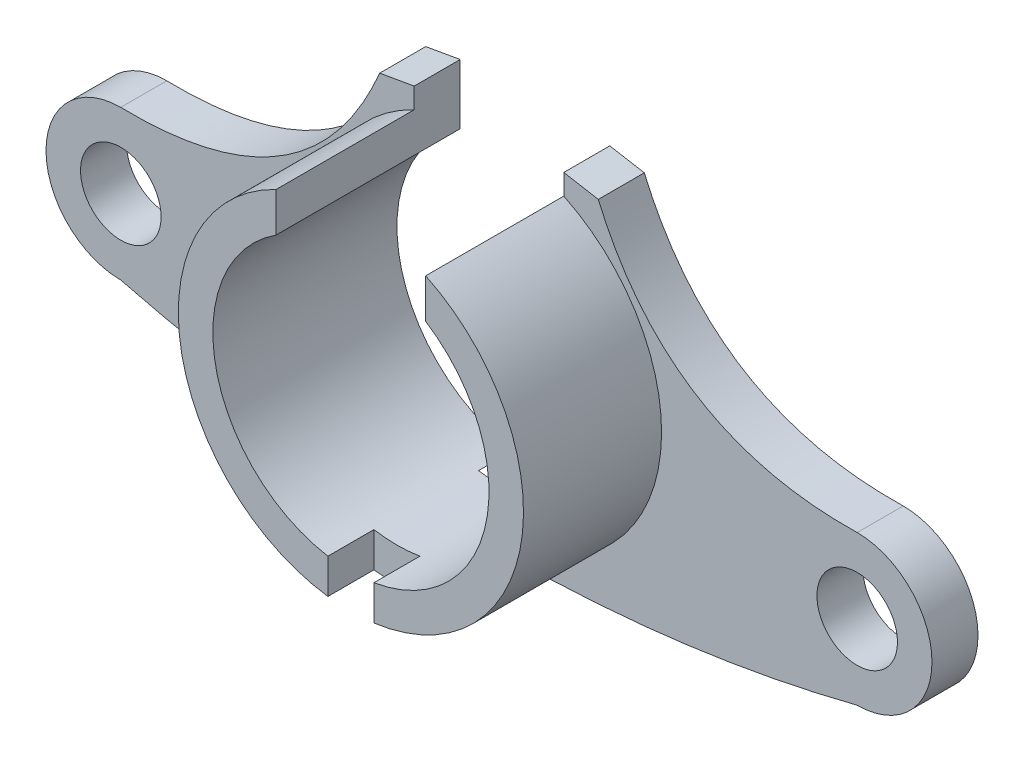
ISO-10303-21;
HEADER;
FILE_DESCRIPTION(('STEP AP214'),'2;1');
FILE_NAME('part.step','',(''),(''),'','','');
FILE_SCHEMA(('AUTOMOTIVE_DESIGN { 1 0 10303 214 1 1 1 1 }'));
ENDSEC;
DATA;
#1=APPLICATION_CONTEXT('core data for automotive mechanical design processes');
#2=APPLICATION_PROTOCOL_DEFINITION('international standard','automotive_design',2000,#1);
#3=PRODUCT_CONTEXT('',#1,'mechanical');
#4=PRODUCT('Part','Part','',(#3));
#5=PRODUCT_RELATED_PRODUCT_CATEGORY('part','',(#4));
#6=PRODUCT_DEFINITION_FORMATION('','',#4);
#7=PRODUCT_DEFINITION_CONTEXT('part definition',#1,'design');
#8=PRODUCT_DEFINITION('design','',#6,#7);
#9=PRODUCT_DEFINITION_SHAPE('','',#8);
#10=(LENGTH_UNIT() NAMED_UNIT(*) SI_UNIT(.MILLI.,.METRE.));
#11=(NAMED_UNIT(*) PLANE_ANGLE_UNIT() SI_UNIT($,.RADIAN.));
#12=(NAMED_UNIT(*) SI_UNIT($,.STERADIAN.) SOLID_ANGLE_UNIT());
#13=UNCERTAINTY_MEASURE_WITH_UNIT(LENGTH_MEASURE(1.E-05),#10,'distance_accuracy_value','');
#14=(GEOMETRIC_REPRESENTATION_CONTEXT(3) GLOBAL_UNCERTAINTY_ASSIGNED_CONTEXT((#13)) GLOBAL_UNIT_ASSIGNED_CONTEXT((#10,
#11,#12)) REPRESENTATION_CONTEXT('',''));
#15=CARTESIAN_POINT('',(0.,0.,0.));
#16=DIRECTION('',(0.,0.,1.));
#17=DIRECTION('',(1.,0.,0.));
#18=AXIS2_PLACEMENT_3D('',#15,#16,#17);
#19=CARTESIAN_POINT('',(0.,0.,0.));
#20=DIRECTION('',(0.,0.,1.));
#21=DIRECTION('',(1.,0.,0.));
#22=AXIS2_PLACEMENT_3D('',#19,#20,#21);
#23=PLANE('',#22);
#24=CARTESIAN_POINT('',(15.9999999999999,81.,0.));
#25=DIRECTION('',(0.,0.,1.));
#26=DIRECTION('',(1.,0.,0.));
#27=AXIS2_PLACEMENT_3D('',#24,#25,#26);
#28=CIRCLE('',#27,1.75);
#29=CARTESIAN_POINT('',(17.7499999999999,81.,0.));
#30=VERTEX_POINT('',#29);
#31=EDGE_CURVE('E312',#30,#30,#28,.T.);
#32=ORIENTED_EDGE('',*,*,#31,.T.);
#33=EDGE_LOOP('',(#32));
#34=FACE_BOUND('',#33,.T.);
#35=CARTESIAN_POINT('',(16.0000000000001,77.75,0.));
#36=CARTESIAN_POINT('',(8.1247968891264,75.7473200210934,0.));
#37=CARTESIAN_POINT('',(0.,75.7769373126975,0.));
#38=B_SPLINE_CURVE_WITH_KNOTS('',2,(#35,#36,#37),.UNSPECIFIED.,.F.,.F.,(3,3),(0.,1.),.UNSPECIFIED.);
#39=CARTESIAN_POINT('',(16.0000000000001,77.75,0.));
#40=VERTEX_POINT('',#39);
#41=CARTESIAN_POINT('',(2.69465862007577,75.8232627262224,0.));
#42=VERTEX_POINT('',#41);
#43=EDGE_CURVE('E287',#40,#42,#38,.T.);
#44=ORIENTED_EDGE('',*,*,#43,.T.);
#45=CARTESIAN_POINT('',(0.,75.2743411277665,0.));
#46=DIRECTION('',(0.,0.,1.));
#47=DIRECTION('',(1.,0.,0.));
#48=AXIS2_PLACEMENT_3D('',#45,#46,#47);
#49=CIRCLE('',#48,2.75);
#50=CARTESIAN_POINT('',(0.954559028470362,77.853355873976,0.));
#51=VERTEX_POINT('',#50);
#52=EDGE_CURVE('E42',#42,#51,#49,.T.);
#53=ORIENTED_EDGE('',*,*,#52,.T.);
#54=CARTESIAN_POINT('',(0.,83.7769373126975,0.));
#55=DIRECTION('',(0.,0.,1.));
#56=DIRECTION('',(1.,0.,0.));
#57=AXIS2_PLACEMENT_3D('',#54,#55,#56);
#58=CIRCLE('',#57,6.00000000000001);
#59=CARTESIAN_POINT('',(3.25,88.8204975631555,0.));
#60=VERTEX_POINT('',#59);
#61=EDGE_CURVE('E283',#51,#60,#58,.T.);
#62=ORIENTED_EDGE('',*,*,#61,.T.);
#63=DIRECTION('',(0.,1.,0.));
#64=VECTOR('',#63,1.);
#65=CARTESIAN_POINT('',(3.24999999999998,0.,0.));
#66=LINE('',#65,#64);
#67=CARTESIAN_POINT('',(3.25,91.4269373126975,0.));
#68=VERTEX_POINT('',#67);
#69=EDGE_CURVE('E297',#60,#68,#66,.T.);
#70=ORIENTED_EDGE('',*,*,#69,.T.);
#71=DIRECTION('',(-0.984807753012208,0.173648177666933,0.));
#72=VECTOR('',#71,1.);
#73=CARTESIAN_POINT('',(15.732926592981,89.2258605561517,0.));
#74=LINE('',#73,#72);
#75=CARTESIAN_POINT('',(4.74999999999999,91.1624468416348,0.));
#76=VERTEX_POINT('',#75);
#77=EDGE_CURVE('E301',#76,#68,#74,.T.);
#78=ORIENTED_EDGE('',*,*,#77,.F.);
#79=CARTESIAN_POINT('',(16.0000000000001,84.25,0.));
#80=CARTESIAN_POINT('',(7.77936860037764,84.0631039143274,0.));
#81=CARTESIAN_POINT('',(4.75,91.1624468416348,0.));
#82=B_SPLINE_CURVE_WITH_KNOTS('',2,(#79,#80,#81),.UNSPECIFIED.,.F.,.F.,(3,3),(0.,1.),.UNSPECIFIED.);
#83=CARTESIAN_POINT('',(16.0000000000001,84.25,0.));
#84=VERTEX_POINT('',#83);
#85=EDGE_CURVE('E376',#84,#76,#82,.T.);
#86=ORIENTED_EDGE('',*,*,#85,.F.);
#87=CARTESIAN_POINT('',(15.9999999999999,81.,0.));
#88=DIRECTION('',(0.,0.,1.));
#89=DIRECTION('',(1.,0.,0.));
#90=AXIS2_PLACEMENT_3D('',#87,#88,#89);
#91=CIRCLE('',#90,3.25);
#92=EDGE_CURVE('E371',#40,#84,#91,.T.);
#93=ORIENTED_EDGE('',*,*,#92,.F.);
#94=EDGE_LOOP('',(#44,#53,#62,#70,#78,#86,#93));
#95=FACE_BOUND('',#94,.T.);
#96=ADVANCED_FACE('F33',(#34,#95),#23,.F.);
#97=CARTESIAN_POINT('',(0.,0.,8.));
#98=DIRECTION('',(0.,0.,1.));
#99=DIRECTION('',(1.,0.,0.));
#100=AXIS2_PLACEMENT_3D('',#97,#98,#99);
#101=PLANE('',#100);
#102=DIRECTION('',(0.,-1.,0.));
#103=VECTOR('',#102,1.);
#104=CARTESIAN_POINT('',(-0.999999999999999,77.8608575295979,8.));
#105=LINE('',#104,#103);
#106=CARTESIAN_POINT('',(-0.999999999999999,77.8608575295979,8.));
#107=VERTEX_POINT('',#106);
#108=CARTESIAN_POINT('',(-0.999999999999999,76.3439029390382,8.));
#109=VERTEX_POINT('',#108);
#110=EDGE_CURVE('E188',#107,#109,#105,.T.);
#111=ORIENTED_EDGE('',*,*,#110,.F.);
#112=CARTESIAN_POINT('',(0.,83.7769373126975,8.));
#113=DIRECTION('',(0.,0.,1.));
#114=DIRECTION('',(1.,0.,0.));
#115=AXIS2_PLACEMENT_3D('',#112,#113,#114);
#116=CIRCLE('',#115,6.00000000000001);
#117=CARTESIAN_POINT('',(-3.25,88.8204975631555,8.));
#118=VERTEX_POINT('',#117);
#119=EDGE_CURVE('E246',#107,#118,#116,.F.);
#120=ORIENTED_EDGE('',*,*,#119,.T.);
#121=DIRECTION('',(0.,1.,0.));
#122=VECTOR('',#121,1.);
#123=CARTESIAN_POINT('',(-3.24999999999998,0.,8.));
#124=LINE('',#123,#122);
#125=CARTESIAN_POINT('',(-3.25,90.5361902299954,8.));
#126=VERTEX_POINT('',#125);
#127=EDGE_CURVE('E236',#118,#126,#124,.T.);
#128=ORIENTED_EDGE('',*,*,#127,.T.);
#129=CARTESIAN_POINT('',(0.,83.7769373126975,8.));
#130=DIRECTION('',(0.,0.,1.));
#131=DIRECTION('',(1.,0.,0.));
#132=AXIS2_PLACEMENT_3D('',#129,#130,#131);
#133=CIRCLE('',#132,7.5);
#134=EDGE_CURVE('E240',#126,#109,#133,.T.);
#135=ORIENTED_EDGE('',*,*,#134,.T.);
#136=EDGE_LOOP('',(#111,#120,#128,#135));
#137=FACE_BOUND('',#136,.T.);
#138=ADVANCED_FACE('F480',(#137),#101,.T.);
#139=CARTESIAN_POINT('',(-16.0000000000001,84.25,2.));
#140=CARTESIAN_POINT('',(-7.77936860037764,84.0631039143274,2.));
#141=CARTESIAN_POINT('',(-4.75,91.1624468416348,2.));
#142=B_SPLINE_CURVE_WITH_KNOTS('',2,(#139,#140,#141),.UNSPECIFIED.,.F.,.F.,(3,3),(0.,1.),.UNSPECIFIED.);
#143=DIRECTION('',(0.,0.,-1.));
#144=VECTOR('',#143,1.);
#145=SURFACE_OF_LINEAR_EXTRUSION('',#142,#144);
#146=CARTESIAN_POINT('',(-16.0000000000001,84.25,0.));
#147=CARTESIAN_POINT('',(-7.77936860037764,84.0631039143274,0.));
#148=CARTESIAN_POINT('',(-4.75,91.1624468416348,0.));
#149=B_SPLINE_CURVE_WITH_KNOTS('',2,(#146,#147,#148),.UNSPECIFIED.,.F.,.F.,(3,3),(0.,1.),.UNSPECIFIED.);
#150=CARTESIAN_POINT('',(-16.0000000000001,84.25,0.));
#151=VERTEX_POINT('',#150);
#152=CARTESIAN_POINT('',(-4.75,91.1624468416348,0.));
#153=VERTEX_POINT('',#152);
#154=EDGE_CURVE('E271',#151,#153,#149,.T.);
#155=ORIENTED_EDGE('',*,*,#154,.F.);
#156=DIRECTION('',(0.,0.,-1.));
#157=VECTOR('',#156,1.);
#158=CARTESIAN_POINT('',(-16.0000000000001,84.25,2.));
#159=LINE('',#158,#157);
#160=CARTESIAN_POINT('',(-16.0000000000001,84.25,2.));
#161=VERTEX_POINT('',#160);
#162=EDGE_CURVE('E277',#161,#151,#159,.T.);
#163=ORIENTED_EDGE('',*,*,#162,.F.);
#164=CARTESIAN_POINT('',(-4.75,91.1624468416348,2.));
#165=VERTEX_POINT('',#164);
#166=EDGE_CURVE('E252',#161,#165,#142,.T.);
#167=ORIENTED_EDGE('',*,*,#166,.T.);
#168=DIRECTION('',(0.,0.,-1.));
#169=VECTOR('',#168,1.);
#170=CARTESIAN_POINT('',(-4.75,91.1624468416348,2.));
#171=LINE('',#170,#169);
#172=EDGE_CURVE('E315',#165,#153,#171,.T.);
#173=ORIENTED_EDGE('',*,*,#172,.T.);
#174=EDGE_LOOP('',(#155,#163,#167,#173));
#175=FACE_BOUND('',#174,.T.);
#176=ADVANCED_FACE('F35',(#175),#145,.T.);
#177=CARTESIAN_POINT('',(-16.0000000000001,81.,2.));
#178=DIRECTION('',(0.,0.,-1.));
#179=DIRECTION('',(-1.,0.,0.));
#180=AXIS2_PLACEMENT_3D('',#177,#178,#179);
#181=CYLINDRICAL_SURFACE('',#180,3.25);
#182=CARTESIAN_POINT('',(-16.0000000000001,81.,0.));
#183=DIRECTION('',(0.,0.,1.));
#184=DIRECTION('',(1.,0.,0.));
#185=AXIS2_PLACEMENT_3D('',#182,#183,#184);
#186=CIRCLE('',#185,3.25);
#187=CARTESIAN_POINT('',(-16.0000000000001,77.75,0.));
#188=VERTEX_POINT('',#187);
#189=EDGE_CURVE('E357',#151,#188,#186,.T.);
#190=ORIENTED_EDGE('',*,*,#189,.T.);
#191=DIRECTION('',(0.,0.,-1.));
#192=VECTOR('',#191,1.);
#193=CARTESIAN_POINT('',(-16.0000000000001,77.75,2.));
#194=LINE('',#193,#192);
#195=CARTESIAN_POINT('',(-16.0000000000001,77.75,2.));
#196=VERTEX_POINT('',#195);
#197=EDGE_CURVE('E336',#196,#188,#194,.T.);
#198=ORIENTED_EDGE('',*,*,#197,.F.);
#199=CARTESIAN_POINT('',(-16.0000000000001,81.,2.));
#200=DIRECTION('',(0.,0.,1.));
#201=DIRECTION('',(1.,0.,0.));
#202=AXIS2_PLACEMENT_3D('',#199,#200,#201);
#203=CIRCLE('',#202,3.25);
#204=EDGE_CURVE('E437',#161,#196,#203,.T.);
#205=ORIENTED_EDGE('',*,*,#204,.F.);
#206=ORIENTED_EDGE('',*,*,#162,.T.);
#207=EDGE_LOOP('',(#190,#198,#205,#206));
#208=FACE_BOUND('',#207,.T.);
#209=ADVANCED_FACE('F460',(#208),#181,.T.);
#210=CARTESIAN_POINT('',(-16.0000000000001,77.75,2.));
#211=CARTESIAN_POINT('',(-8.1247968891264,75.7473200210934,2.));
#212=CARTESIAN_POINT('',(0.,75.7769373126975,2.));
#213=B_SPLINE_CURVE_WITH_KNOTS('',2,(#210,#211,#212),.UNSPECIFIED.,.F.,.F.,(3,3),(0.,1.),.UNSPECIFIED.);
#214=DIRECTION('',(0.,0.,-1.));
#215=VECTOR('',#214,1.);
#216=SURFACE_OF_LINEAR_EXTRUSION('',#213,#215);
#217=CARTESIAN_POINT('',(-16.0000000000001,77.75,0.));
#218=CARTESIAN_POINT('',(-8.1247968891264,75.7473200210934,0.));
#219=CARTESIAN_POINT('',(0.,75.7769373126975,0.));
#220=B_SPLINE_CURVE_WITH_KNOTS('',2,(#217,#218,#219),.UNSPECIFIED.,.F.,.F.,(3,3),(0.,1.),.UNSPECIFIED.);
#221=CARTESIAN_POINT('',(-2.69465862007577,75.8232627262224,0.));
#222=VERTEX_POINT('',#221);
#223=EDGE_CURVE('E200',#188,#222,#220,.T.);
#224=ORIENTED_EDGE('',*,*,#223,.T.);
#225=DIRECTION('',(0.,0.,-1.));
#226=VECTOR('',#225,1.);
#227=CARTESIAN_POINT('',(-2.69465862007577,75.8232627262224,2.));
#228=LINE('',#227,#226);
#229=CARTESIAN_POINT('',(-2.69465862007577,75.8232627262224,1.5));
#230=VERTEX_POINT('',#229);
#231=EDGE_CURVE('E49',#222,#230,#228,.F.);
#232=ORIENTED_EDGE('',*,*,#231,.T.);
#233=CARTESIAN_POINT('',(-16.0000000000001,77.75,1.5));
#234=CARTESIAN_POINT('',(-8.1247968891264,75.7473200210934,1.5));
#235=CARTESIAN_POINT('',(0.,75.7769373126975,1.5));
#236=B_SPLINE_CURVE_WITH_KNOTS('',2,(#233,#234,#235),.UNSPECIFIED.,.F.,.F.,(3,3),(0.,1.),.UNSPECIFIED.);
#237=CARTESIAN_POINT('',(0.,75.7769373126975,1.5));
#238=VERTEX_POINT('',#237);
#239=EDGE_CURVE('E179',#238,#230,#236,.F.);
#240=ORIENTED_EDGE('',*,*,#239,.F.);
#241=DIRECTION('',(0.,0.,-1.));
#242=VECTOR('',#241,1.);
#243=CARTESIAN_POINT('',(0.,75.7769373126975,2.));
#244=LINE('',#243,#242);
#245=CARTESIAN_POINT('',(0.,75.7769373126975,2.));
#246=VERTEX_POINT('',#245);
#247=EDGE_CURVE('E334',#246,#238,#244,.T.);
#248=ORIENTED_EDGE('',*,*,#247,.F.);
#249=EDGE_CURVE('E430',#196,#246,#213,.T.);
#250=ORIENTED_EDGE('',*,*,#249,.F.);
#251=ORIENTED_EDGE('',*,*,#197,.T.);
#252=EDGE_LOOP('',(#224,#232,#240,#248,#250,#251));
#253=FACE_BOUND('',#252,.T.);
#254=ADVANCED_FACE('F197',(#253),#216,.F.);
#255=CARTESIAN_POINT('',(16.0000000000001,77.75,2.));
#256=CARTESIAN_POINT('',(8.1247968891264,75.7473200210934,2.));
#257=CARTESIAN_POINT('',(0.,75.7769373126975,2.));
#258=B_SPLINE_CURVE_WITH_KNOTS('',2,(#255,#256,#257),.UNSPECIFIED.,.F.,.F.,(3,3),(0.,1.),.UNSPECIFIED.);
#259=DIRECTION('',(0.,0.,-1.));
#260=VECTOR('',#259,1.);
#261=SURFACE_OF_LINEAR_EXTRUSION('',#258,#260);
#262=DIRECTION('',(0.,0.,-1.));
#263=VECTOR('',#262,1.);
#264=CARTESIAN_POINT('',(2.69465862007578,75.8232627262224,2.));
#265=LINE('',#264,#263);
#266=CARTESIAN_POINT('',(2.69465862007577,75.8232627262224,1.5));
#267=VERTEX_POINT('',#266);
#268=EDGE_CURVE('E201',#42,#267,#265,.F.);
#269=ORIENTED_EDGE('',*,*,#268,.F.);
#270=ORIENTED_EDGE('',*,*,#43,.F.);
#271=DIRECTION('',(0.,0.,-1.));
#272=VECTOR('',#271,1.);
#273=CARTESIAN_POINT('',(16.0000000000001,77.75,2.));
#274=LINE('',#273,#272);
#275=CARTESIAN_POINT('',(16.0000000000001,77.75,2.));
#276=VERTEX_POINT('',#275);
#277=EDGE_CURVE('E332',#276,#40,#274,.T.);
#278=ORIENTED_EDGE('',*,*,#277,.F.);
#279=EDGE_CURVE('E401',#276,#246,#258,.T.);
#280=ORIENTED_EDGE('',*,*,#279,.T.);
#281=ORIENTED_EDGE('',*,*,#247,.T.);
#282=CARTESIAN_POINT('',(16.0000000000001,77.75,1.5));
#283=CARTESIAN_POINT('',(8.1247968891264,75.7473200210934,1.5));
#284=CARTESIAN_POINT('',(0.,75.7769373126975,1.5));
#285=B_SPLINE_CURVE_WITH_KNOTS('',2,(#282,#283,#284),.UNSPECIFIED.,.F.,.F.,(3,3),(0.,1.),.UNSPECIFIED.);
#286=EDGE_CURVE('E184',#238,#267,#285,.F.);
#287=ORIENTED_EDGE('',*,*,#286,.T.);
#288=EDGE_LOOP('',(#269,#270,#278,#280,#281,#287));
#289=FACE_BOUND('',#288,.T.);
#290=ADVANCED_FACE('F420',(#289),#261,.T.);
#291=CARTESIAN_POINT('',(15.9999999999999,81.,2.));
#292=DIRECTION('',(0.,0.,-1.));
#293=DIRECTION('',(-1.,0.,0.));
#294=AXIS2_PLACEMENT_3D('',#291,#292,#293);
#295=CYLINDRICAL_SURFACE('',#294,3.25);
#296=ORIENTED_EDGE('',*,*,#92,.T.);
#297=DIRECTION('',(0.,0.,-1.));
#298=VECTOR('',#297,1.);
#299=CARTESIAN_POINT('',(16.0000000000001,84.25,2.));
#300=LINE('',#299,#298);
#301=CARTESIAN_POINT('',(16.0000000000001,84.25,2.));
#302=VERTEX_POINT('',#301);
#303=EDGE_CURVE('E329',#302,#84,#300,.T.);
#304=ORIENTED_EDGE('',*,*,#303,.F.);
#305=CARTESIAN_POINT('',(15.9999999999999,81.,2.));
#306=DIRECTION('',(0.,0.,1.));
#307=DIRECTION('',(1.,0.,0.));
#308=AXIS2_PLACEMENT_3D('',#305,#306,#307);
#309=CIRCLE('',#308,3.25);
#310=EDGE_CURVE('E400',#276,#302,#309,.T.);
#311=ORIENTED_EDGE('',*,*,#310,.F.);
#312=ORIENTED_EDGE('',*,*,#277,.T.);
#313=EDGE_LOOP('',(#296,#304,#311,#312));
#314=FACE_BOUND('',#313,.T.);
#315=ADVANCED_FACE('F415',(#314),#295,.T.);
#316=CARTESIAN_POINT('',(16.0000000000001,84.25,2.));
#317=CARTESIAN_POINT('',(7.77936860037764,84.0631039143274,2.));
#318=CARTESIAN_POINT('',(4.75,91.1624468416348,2.));
#319=B_SPLINE_CURVE_WITH_KNOTS('',2,(#316,#317,#318),.UNSPECIFIED.,.F.,.F.,(3,3),(0.,1.),.UNSPECIFIED.);
#320=DIRECTION('',(0.,0.,-1.));
#321=VECTOR('',#320,1.);
#322=SURFACE_OF_LINEAR_EXTRUSION('',#319,#321);
#323=ORIENTED_EDGE('',*,*,#85,.T.);
#324=DIRECTION('',(0.,0.,-1.));
#325=VECTOR('',#324,1.);
#326=CARTESIAN_POINT('',(4.74999999999999,91.1624468416348,2.));
#327=LINE('',#326,#325);
#328=CARTESIAN_POINT('',(4.74999999999999,91.1624468416348,2.));
#329=VERTEX_POINT('',#328);
#330=EDGE_CURVE('E326',#329,#76,#327,.T.);
#331=ORIENTED_EDGE('',*,*,#330,.F.);
#332=EDGE_CURVE('E399',#302,#329,#319,.T.);
#333=ORIENTED_EDGE('',*,*,#332,.F.);
#334=ORIENTED_EDGE('',*,*,#303,.T.);
#335=EDGE_LOOP('',(#323,#331,#333,#334));
#336=FACE_BOUND('',#335,.T.);
#337=ADVANCED_FACE('F411',(#336),#322,.F.);
#338=CARTESIAN_POINT('',(15.732926592981,89.2258605561517,2.));
#339=DIRECTION('',(-0.173648177666933,-0.984807753012208,0.));
#340=DIRECTION('',(0.984807753012208,-0.173648177666933,0.));
#341=AXIS2_PLACEMENT_3D('',#338,#339,#340);
#342=PLANE('',#341);
#343=ORIENTED_EDGE('',*,*,#77,.T.);
#344=DIRECTION('',(0.,0.,-1.));
#345=VECTOR('',#344,1.);
#346=CARTESIAN_POINT('',(3.25,91.4269373126975,2.));
#347=LINE('',#346,#345);
#348=CARTESIAN_POINT('',(3.25,91.4269373126975,2.));
#349=VERTEX_POINT('',#348);
#350=EDGE_CURVE('E324',#349,#68,#347,.T.);
#351=ORIENTED_EDGE('',*,*,#350,.F.);
#352=DIRECTION('',(-0.984807753012208,0.173648177666933,0.));
#353=VECTOR('',#352,1.);
#354=CARTESIAN_POINT('',(15.732926592981,89.2258605561517,2.));
#355=LINE('',#354,#353);
#356=EDGE_CURVE('E340',#329,#349,#355,.T.);
#357=ORIENTED_EDGE('',*,*,#356,.F.);
#358=ORIENTED_EDGE('',*,*,#330,.T.);
#359=EDGE_LOOP('',(#343,#351,#357,#358));
#360=FACE_BOUND('',#359,.T.);
#361=ADVANCED_FACE('F386',(#360),#342,.F.);
#362=CARTESIAN_POINT('',(3.24999999999998,0.,2.));
#363=DIRECTION('',(-1.,0.,0.));
#364=DIRECTION('',(0.,-1.,0.));
#365=AXIS2_PLACEMENT_3D('',#362,#363,#364);
#366=PLANE('',#365);
#367=ORIENTED_EDGE('',*,*,#69,.F.);
#368=DIRECTION('',(0.,0.,-1.));
#369=VECTOR('',#368,1.);
#370=CARTESIAN_POINT('',(3.25,88.8204975631555,2.));
#371=LINE('',#370,#369);
#372=CARTESIAN_POINT('',(3.25,88.8204975631555,8.));
#373=VERTEX_POINT('',#372);
#374=EDGE_CURVE('E294',#373,#60,#371,.T.);
#375=ORIENTED_EDGE('',*,*,#374,.F.);
#376=DIRECTION('',(0.,-1.,0.));
#377=VECTOR('',#376,1.);
#378=CARTESIAN_POINT('',(3.24999999999998,0.,8.));
#379=LINE('',#378,#377);
#380=CARTESIAN_POINT('',(3.25,90.5361902299954,8.));
#381=VERTEX_POINT('',#380);
#382=EDGE_CURVE('E243',#381,#373,#379,.T.);
#383=ORIENTED_EDGE('',*,*,#382,.F.);
#384=DIRECTION('',(0.,0.,-1.));
#385=VECTOR('',#384,1.);
#386=CARTESIAN_POINT('',(3.25,90.5361902299954,8.));
#387=LINE('',#386,#385);
#388=CARTESIAN_POINT('',(3.25,90.5361902299954,2.));
#389=VERTEX_POINT('',#388);
#390=EDGE_CURVE('E250',#381,#389,#387,.T.);
#391=ORIENTED_EDGE('',*,*,#390,.T.);
#392=DIRECTION('',(0.,1.,0.));
#393=VECTOR('',#392,1.);
#394=CARTESIAN_POINT('',(3.24999999999998,0.,2.));
#395=LINE('',#394,#393);
#396=EDGE_CURVE('E338',#389,#349,#395,.T.);
#397=ORIENTED_EDGE('',*,*,#396,.T.);
#398=ORIENTED_EDGE('',*,*,#350,.T.);
#399=EDGE_LOOP('',(#367,#375,#383,#391,#397,#398));
#400=FACE_BOUND('',#399,.T.);
#401=ADVANCED_FACE('F391',(#400),#366,.T.);
#402=CARTESIAN_POINT('',(0.,83.7769373126975,2.));
#403=DIRECTION('',(0.,0.,-1.));
#404=DIRECTION('',(-1.,0.,0.));
#405=AXIS2_PLACEMENT_3D('',#402,#403,#404);
#406=CYLINDRICAL_SURFACE('',#405,6.00000000000001);
#407=DIRECTION('',(0.,0.,-1.));
#408=VECTOR('',#407,1.);
#409=CARTESIAN_POINT('',(-0.954559028470357,77.853355873976,0.75));
#410=LINE('',#409,#408);
#411=CARTESIAN_POINT('',(-0.954559028470359,77.853355873976,0.));
#412=VERTEX_POINT('',#411);
#413=CARTESIAN_POINT('',(-0.954559028470358,77.853355873976,1.5));
#414=VERTEX_POINT('',#413);
#415=EDGE_CURVE('E192',#412,#414,#410,.F.);
#416=ORIENTED_EDGE('',*,*,#415,.F.);
#417=CARTESIAN_POINT('',(-3.25,88.8204975631555,0.));
#418=VERTEX_POINT('',#417);
#419=EDGE_CURVE('E296',#418,#412,#58,.T.);
#420=ORIENTED_EDGE('',*,*,#419,.F.);
#421=DIRECTION('',(0.,0.,-1.));
#422=VECTOR('',#421,1.);
#423=CARTESIAN_POINT('',(-3.25,88.8204975631555,2.));
#424=LINE('',#423,#422);
#425=EDGE_CURVE('E321',#118,#418,#424,.T.);
#426=ORIENTED_EDGE('',*,*,#425,.F.);
#427=ORIENTED_EDGE('',*,*,#119,.F.);
#428=DIRECTION('',(0.,0.,1.));
#429=VECTOR('',#428,1.);
#430=CARTESIAN_POINT('',(-0.999999999999999,77.8608575295979,6.));
#431=LINE('',#430,#429);
#432=CARTESIAN_POINT('',(-0.999999999999999,77.8608575295979,6.));
#433=VERTEX_POINT('',#432);
#434=EDGE_CURVE('E224',#433,#107,#431,.T.);
#435=ORIENTED_EDGE('',*,*,#434,.F.);
#436=CARTESIAN_POINT('',(0.,83.7769373126975,6.));
#437=DIRECTION('',(0.,0.,1.));
#438=DIRECTION('',(1.,0.,0.));
#439=AXIS2_PLACEMENT_3D('',#436,#437,#438);
#440=CIRCLE('',#439,6.00000000000001);
#441=CARTESIAN_POINT('',(1.,77.8608575295979,6.));
#442=VERTEX_POINT('',#441);
#443=EDGE_CURVE('E232',#433,#442,#440,.T.);
#444=ORIENTED_EDGE('',*,*,#443,.T.);
#445=DIRECTION('',(0.,0.,1.));
#446=VECTOR('',#445,1.);
#447=CARTESIAN_POINT('',(1.,77.8608575295979,6.));
#448=LINE('',#447,#446);
#449=CARTESIAN_POINT('',(1.,77.8608575295979,8.));
#450=VERTEX_POINT('',#449);
#451=EDGE_CURVE('E222',#442,#450,#448,.T.);
#452=ORIENTED_EDGE('',*,*,#451,.T.);
#453=EDGE_CURVE('E247',#373,#450,#116,.F.);
#454=ORIENTED_EDGE('',*,*,#453,.F.);
#455=ORIENTED_EDGE('',*,*,#374,.T.);
#456=ORIENTED_EDGE('',*,*,#61,.F.);
#457=DIRECTION('',(0.,0.,-1.));
#458=VECTOR('',#457,1.);
#459=CARTESIAN_POINT('',(0.95455902847036,77.853355873976,0.75));
#460=LINE('',#459,#458);
#461=CARTESIAN_POINT('',(0.954559028470362,77.853355873976,1.5));
#462=VERTEX_POINT('',#461);
#463=EDGE_CURVE('E193',#462,#51,#460,.T.);
#464=ORIENTED_EDGE('',*,*,#463,.F.);
#465=CARTESIAN_POINT('',(0.,83.7769373126975,1.5));
#466=DIRECTION('',(0.,0.,-1.));
#467=DIRECTION('',(-1.,0.,0.));
#468=AXIS2_PLACEMENT_3D('',#465,#466,#467);
#469=CIRCLE('',#468,6.00000000000001);
#470=EDGE_CURVE('E11',#462,#414,#469,.T.);
#471=ORIENTED_EDGE('',*,*,#470,.T.);
#472=EDGE_LOOP('',(#416,#420,#426,#427,#435,#444,#452,#454,#455,#456,#464,#471));
#473=FACE_BOUND('',#472,.T.);
#474=ADVANCED_FACE('F292',(#473),#406,.F.);
#475=CARTESIAN_POINT('',(-3.24999999999998,0.,2.));
#476=DIRECTION('',(-1.,0.,0.));
#477=DIRECTION('',(0.,-1.,0.));
#478=AXIS2_PLACEMENT_3D('',#475,#476,#477);
#479=PLANE('',#478);
#480=DIRECTION('',(0.,1.,0.));
#481=VECTOR('',#480,1.);
#482=CARTESIAN_POINT('',(-3.24999999999998,0.,0.));
#483=LINE('',#482,#481);
#484=CARTESIAN_POINT('',(-3.25,91.4269373126975,0.));
#485=VERTEX_POINT('',#484);
#486=EDGE_CURVE('E300',#418,#485,#483,.T.);
#487=ORIENTED_EDGE('',*,*,#486,.T.);
#488=DIRECTION('',(0.,0.,-1.));
#489=VECTOR('',#488,1.);
#490=CARTESIAN_POINT('',(-3.25,91.4269373126975,2.));
#491=LINE('',#490,#489);
#492=CARTESIAN_POINT('',(-3.25,91.4269373126975,2.));
#493=VERTEX_POINT('',#492);
#494=EDGE_CURVE('E317',#493,#485,#491,.T.);
#495=ORIENTED_EDGE('',*,*,#494,.F.);
#496=DIRECTION('',(0.,1.,0.));
#497=VECTOR('',#496,1.);
#498=CARTESIAN_POINT('',(-3.24999999999998,0.,2.));
#499=LINE('',#498,#497);
#500=CARTESIAN_POINT('',(-3.25,90.5361902299954,2.));
#501=VERTEX_POINT('',#500);
#502=EDGE_CURVE('E261',#501,#493,#499,.T.);
#503=ORIENTED_EDGE('',*,*,#502,.F.);
#504=DIRECTION('',(0.,0.,-1.));
#505=VECTOR('',#504,1.);
#506=CARTESIAN_POINT('',(-3.25,90.5361902299954,8.));
#507=LINE('',#506,#505);
#508=EDGE_CURVE('E266',#126,#501,#507,.T.);
#509=ORIENTED_EDGE('',*,*,#508,.F.);
#510=ORIENTED_EDGE('',*,*,#127,.F.);
#511=ORIENTED_EDGE('',*,*,#425,.T.);
#512=EDGE_LOOP('',(#487,#495,#503,#509,#510,#511));
#513=FACE_BOUND('',#512,.T.);
#514=ADVANCED_FACE('F473',(#513),#479,.F.);
#515=CARTESIAN_POINT('',(-16.0000000000001,81.,2.));
#516=DIRECTION('',(0.,0.,-1.));
#517=DIRECTION('',(-1.,0.,0.));
#518=AXIS2_PLACEMENT_3D('',#515,#516,#517);
#519=CYLINDRICAL_SURFACE('',#518,1.75);
#520=CARTESIAN_POINT('',(-16.0000000000001,81.,2.));
#521=DIRECTION('',(0.,0.,1.));
#522=DIRECTION('',(1.,0.,0.));
#523=AXIS2_PLACEMENT_3D('',#520,#521,#522);
#524=CIRCLE('',#523,1.75);
#525=CARTESIAN_POINT('',(-14.2500000000001,81.,2.));
#526=VERTEX_POINT('',#525);
#527=EDGE_CURVE('E348',#526,#526,#524,.T.);
#528=ORIENTED_EDGE('',*,*,#527,.T.);
#529=EDGE_LOOP('',(#528));
#530=FACE_BOUND('',#529,.T.);
#531=CARTESIAN_POINT('',(-16.0000000000001,81.,0.));
#532=DIRECTION('',(0.,0.,1.));
#533=DIRECTION('',(1.,0.,0.));
#534=AXIS2_PLACEMENT_3D('',#531,#532,#533);
#535=CIRCLE('',#534,1.75);
#536=CARTESIAN_POINT('',(-14.2500000000001,81.,0.));
#537=VERTEX_POINT('',#536);
#538=EDGE_CURVE('E309',#537,#537,#535,.T.);
#539=ORIENTED_EDGE('',*,*,#538,.F.);
#540=EDGE_LOOP('',(#539));
#541=FACE_BOUND('',#540,.T.);
#542=ADVANCED_FACE('F523',(#530,#541),#519,.F.);
#543=CARTESIAN_POINT('',(-15.732926592981,89.2258605561517,2.));
#544=DIRECTION('',(0.173648177666933,-0.984807753012208,0.));
#545=DIRECTION('',(0.984807753012208,0.173648177666933,0.));
#546=AXIS2_PLACEMENT_3D('',#543,#544,#545);
#547=PLANE('',#546);
#548=DIRECTION('',(-0.984807753012208,-0.173648177666933,0.));
#549=VECTOR('',#548,1.);
#550=CARTESIAN_POINT('',(-15.732926592981,89.2258605561517,0.));
#551=LINE('',#550,#549);
#552=EDGE_CURVE('E306',#485,#153,#551,.T.);
#553=ORIENTED_EDGE('',*,*,#552,.T.);
#554=ORIENTED_EDGE('',*,*,#172,.F.);
#555=DIRECTION('',(-0.984807753012208,-0.173648177666933,0.));
#556=VECTOR('',#555,1.);
#557=CARTESIAN_POINT('',(-15.732926592981,89.2258605561517,2.));
#558=LINE('',#557,#556);
#559=EDGE_CURVE('E346',#493,#165,#558,.T.);
#560=ORIENTED_EDGE('',*,*,#559,.F.);
#561=ORIENTED_EDGE('',*,*,#494,.T.);
#562=EDGE_LOOP('',(#553,#554,#560,#561));
#563=FACE_BOUND('',#562,.T.);
#564=ADVANCED_FACE('F452',(#563),#547,.F.);
#565=CARTESIAN_POINT('',(15.9999999999999,81.,2.));
#566=DIRECTION('',(0.,0.,-1.));
#567=DIRECTION('',(-1.,0.,0.));
#568=AXIS2_PLACEMENT_3D('',#565,#566,#567);
#569=CYLINDRICAL_SURFACE('',#568,1.75);
#570=CARTESIAN_POINT('',(15.9999999999999,81.,2.));
#571=DIRECTION('',(0.,0.,1.));
#572=DIRECTION('',(1.,0.,0.));
#573=AXIS2_PLACEMENT_3D('',#570,#571,#572);
#574=CIRCLE('',#573,1.75);
#575=CARTESIAN_POINT('',(17.7499999999999,81.,2.));
#576=VERTEX_POINT('',#575);
#577=EDGE_CURVE('E318',#576,#576,#574,.T.);
#578=ORIENTED_EDGE('',*,*,#577,.T.);
#579=EDGE_LOOP('',(#578));
#580=FACE_BOUND('',#579,.T.);
#581=ORIENTED_EDGE('',*,*,#31,.F.);
#582=EDGE_LOOP('',(#581));
#583=FACE_BOUND('',#582,.T.);
#584=ADVANCED_FACE('F515',(#580,#583),#569,.F.);
#585=CARTESIAN_POINT('',(0.,0.,2.));
#586=DIRECTION('',(0.,0.,1.));
#587=DIRECTION('',(1.,0.,0.));
#588=AXIS2_PLACEMENT_3D('',#585,#586,#587);
#589=PLANE('',#588);
#590=CARTESIAN_POINT('',(0.,83.7769373126975,2.));
#591=DIRECTION('',(0.,0.,1.));
#592=DIRECTION('',(1.,0.,0.));
#593=AXIS2_PLACEMENT_3D('',#590,#591,#592);
#594=CIRCLE('',#593,7.5);
#595=EDGE_CURVE('E235',#501,#389,#594,.T.);
#596=ORIENTED_EDGE('',*,*,#595,.F.);
#597=ORIENTED_EDGE('',*,*,#502,.T.);
#598=ORIENTED_EDGE('',*,*,#559,.T.);
#599=ORIENTED_EDGE('',*,*,#166,.F.);
#600=ORIENTED_EDGE('',*,*,#204,.T.);
#601=ORIENTED_EDGE('',*,*,#249,.T.);
#602=ORIENTED_EDGE('',*,*,#279,.F.);
#603=ORIENTED_EDGE('',*,*,#310,.T.);
#604=ORIENTED_EDGE('',*,*,#332,.T.);
#605=ORIENTED_EDGE('',*,*,#356,.T.);
#606=ORIENTED_EDGE('',*,*,#396,.F.);
#607=EDGE_LOOP('',(#596,#597,#598,#599,#600,#601,#602,#603,#604,#605,#606));
#608=FACE_BOUND('',#607,.T.);
#609=ORIENTED_EDGE('',*,*,#527,.F.);
#610=EDGE_LOOP('',(#609));
#611=FACE_BOUND('',#610,.T.);
#612=ORIENTED_EDGE('',*,*,#577,.F.);
#613=EDGE_LOOP('',(#612));
#614=FACE_BOUND('',#613,.T.);
#615=ADVANCED_FACE('F396',(#608,#611,#614),#589,.T.);
#616=ORIENTED_EDGE('',*,*,#419,.T.);
#617=CARTESIAN_POINT('',(0.,75.2743411277665,0.));
#618=DIRECTION('',(0.,0.,-1.));
#619=DIRECTION('',(-1.,0.,0.));
#620=AXIS2_PLACEMENT_3D('',#617,#618,#619);
#621=CIRCLE('',#620,2.75);
#622=EDGE_CURVE('E467',#222,#412,#621,.T.);
#623=ORIENTED_EDGE('',*,*,#622,.F.);
#624=ORIENTED_EDGE('',*,*,#223,.F.);
#625=ORIENTED_EDGE('',*,*,#189,.F.);
#626=ORIENTED_EDGE('',*,*,#154,.T.);
#627=ORIENTED_EDGE('',*,*,#552,.F.);
#628=ORIENTED_EDGE('',*,*,#486,.F.);
#629=EDGE_LOOP('',(#616,#623,#624,#625,#626,#627,#628));
#630=FACE_BOUND('',#629,.T.);
#631=ORIENTED_EDGE('',*,*,#538,.T.);
#632=EDGE_LOOP('',(#631));
#633=FACE_BOUND('',#632,.T.);
#634=ADVANCED_FACE('F457',(#630,#633),#23,.F.);
#635=CARTESIAN_POINT('',(0.,83.7769373126975,8.));
#636=DIRECTION('',(0.,0.,-1.));
#637=DIRECTION('',(-1.,0.,0.));
#638=AXIS2_PLACEMENT_3D('',#635,#636,#637);
#639=CYLINDRICAL_SURFACE('',#638,7.5);
#640=CARTESIAN_POINT('',(0.,83.7769373126975,6.));
#641=DIRECTION('',(0.,0.,1.));
#642=DIRECTION('',(1.,0.,0.));
#643=AXIS2_PLACEMENT_3D('',#640,#641,#642);
#644=CIRCLE('',#643,7.5);
#645=CARTESIAN_POINT('',(-0.999999999999999,76.3439029390382,6.));
#646=VERTEX_POINT('',#645);
#647=CARTESIAN_POINT('',(1.,76.3439029390382,6.));
#648=VERTEX_POINT('',#647);
#649=EDGE_CURVE('E276',#646,#648,#644,.T.);
#650=ORIENTED_EDGE('',*,*,#649,.F.);
#651=DIRECTION('',(0.,0.,-1.));
#652=VECTOR('',#651,1.);
#653=CARTESIAN_POINT('',(-0.999999999999999,76.3439029390382,8.));
#654=LINE('',#653,#652);
#655=EDGE_CURVE('E229',#646,#109,#654,.F.);
#656=ORIENTED_EDGE('',*,*,#655,.T.);
#657=ORIENTED_EDGE('',*,*,#134,.F.);
#658=ORIENTED_EDGE('',*,*,#508,.T.);
#659=ORIENTED_EDGE('',*,*,#595,.T.);
#660=ORIENTED_EDGE('',*,*,#390,.F.);
#661=CARTESIAN_POINT('',(1.,76.3439029390382,8.));
#662=VERTEX_POINT('',#661);
#663=EDGE_CURVE('E239',#662,#381,#133,.T.);
#664=ORIENTED_EDGE('',*,*,#663,.F.);
#665=DIRECTION('',(0.,0.,-1.));
#666=VECTOR('',#665,1.);
#667=CARTESIAN_POINT('',(1.,76.3439029390382,8.));
#668=LINE('',#667,#666);
#669=EDGE_CURVE('E57',#662,#648,#668,.T.);
#670=ORIENTED_EDGE('',*,*,#669,.T.);
#671=EDGE_LOOP('',(#650,#656,#657,#658,#659,#660,#664,#670));
#672=FACE_BOUND('',#671,.T.);
#673=ADVANCED_FACE('F486',(#672),#639,.T.);
#674=DIRECTION('',(0.,1.,0.));
#675=VECTOR('',#674,1.);
#676=CARTESIAN_POINT('',(1.00000000000003,0.,8.));
#677=LINE('',#676,#675);
#678=EDGE_CURVE('E274',#662,#450,#677,.T.);
#679=ORIENTED_EDGE('',*,*,#678,.F.);
#680=ORIENTED_EDGE('',*,*,#663,.T.);
#681=ORIENTED_EDGE('',*,*,#382,.T.);
#682=ORIENTED_EDGE('',*,*,#453,.T.);
#683=EDGE_LOOP('',(#679,#680,#681,#682));
#684=FACE_BOUND('',#683,.T.);
#685=ADVANCED_FACE('F493',(#684),#101,.T.);
#686=CARTESIAN_POINT('',(0.,0.,6.));
#687=DIRECTION('',(0.,0.,1.));
#688=DIRECTION('',(1.,0.,0.));
#689=AXIS2_PLACEMENT_3D('',#686,#687,#688);
#690=PLANE('',#689);
#691=DIRECTION('',(0.,-1.,0.));
#692=VECTOR('',#691,1.);
#693=CARTESIAN_POINT('',(-0.999999999999999,77.8608575295979,6.));
#694=LINE('',#693,#692);
#695=EDGE_CURVE('E214',#433,#646,#694,.T.);
#696=ORIENTED_EDGE('',*,*,#695,.T.);
#697=ORIENTED_EDGE('',*,*,#649,.T.);
#698=DIRECTION('',(0.,1.,0.));
#699=VECTOR('',#698,1.);
#700=CARTESIAN_POINT('',(1.,77.8608575295979,6.));
#701=LINE('',#700,#699);
#702=EDGE_CURVE('E220',#648,#442,#701,.T.);
#703=ORIENTED_EDGE('',*,*,#702,.T.);
#704=ORIENTED_EDGE('',*,*,#443,.F.);
#705=EDGE_LOOP('',(#696,#697,#703,#704));
#706=FACE_BOUND('',#705,.T.);
#707=ADVANCED_FACE('F489',(#706),#690,.T.);
#708=CARTESIAN_POINT('',(-0.999999999999999,77.8608575295979,6.));
#709=DIRECTION('',(-1.,0.,0.));
#710=DIRECTION('',(0.,-1.,0.));
#711=AXIS2_PLACEMENT_3D('',#708,#709,#710);
#712=PLANE('',#711);
#713=ORIENTED_EDGE('',*,*,#695,.F.);
#714=ORIENTED_EDGE('',*,*,#434,.T.);
#715=ORIENTED_EDGE('',*,*,#110,.T.);
#716=ORIENTED_EDGE('',*,*,#655,.F.);
#717=EDGE_LOOP('',(#713,#714,#715,#716));
#718=FACE_BOUND('',#717,.T.);
#719=ADVANCED_FACE('F484',(#718),#712,.F.);
#720=CARTESIAN_POINT('',(1.,77.8608575295979,6.));
#721=DIRECTION('',(1.,0.,0.));
#722=DIRECTION('',(0.,1.,0.));
#723=AXIS2_PLACEMENT_3D('',#720,#721,#722);
#724=PLANE('',#723);
#725=ORIENTED_EDGE('',*,*,#678,.T.);
#726=ORIENTED_EDGE('',*,*,#451,.F.);
#727=ORIENTED_EDGE('',*,*,#702,.F.);
#728=ORIENTED_EDGE('',*,*,#669,.F.);
#729=EDGE_LOOP('',(#725,#726,#727,#728));
#730=FACE_BOUND('',#729,.T.);
#731=ADVANCED_FACE('F491',(#730),#724,.F.);
#732=CARTESIAN_POINT('',(0.,75.2743411277665,1.5));
#733=DIRECTION('',(0.,0.,-1.));
#734=DIRECTION('',(-1.,0.,0.));
#735=AXIS2_PLACEMENT_3D('',#732,#733,#734);
#736=PLANE('',#735);
#737=ORIENTED_EDGE('',*,*,#239,.T.);
#738=CARTESIAN_POINT('',(0.,75.2743411277665,1.5));
#739=DIRECTION('',(0.,0.,-1.));
#740=DIRECTION('',(-1.,0.,0.));
#741=AXIS2_PLACEMENT_3D('',#738,#739,#740);
#742=CIRCLE('',#741,2.75);
#743=EDGE_CURVE('E181',#230,#414,#742,.T.);
#744=ORIENTED_EDGE('',*,*,#743,.T.);
#745=ORIENTED_EDGE('',*,*,#470,.F.);
#746=EDGE_CURVE('E194',#462,#267,#742,.T.);
#747=ORIENTED_EDGE('',*,*,#746,.T.);
#748=ORIENTED_EDGE('',*,*,#286,.F.);
#749=EDGE_LOOP('',(#737,#744,#745,#747,#748));
#750=FACE_BOUND('',#749,.T.);
#751=ADVANCED_FACE('F180',(#750),#736,.T.);
#752=CARTESIAN_POINT('',(0.,75.2743411277665,1.5));
#753=DIRECTION('',(0.,0.,-1.));
#754=DIRECTION('',(-1.,0.,0.));
#755=AXIS2_PLACEMENT_3D('',#752,#753,#754);
#756=CYLINDRICAL_SURFACE('',#755,2.75);
#757=ORIENTED_EDGE('',*,*,#622,.T.);
#758=ORIENTED_EDGE('',*,*,#415,.T.);
#759=ORIENTED_EDGE('',*,*,#743,.F.);
#760=ORIENTED_EDGE('',*,*,#231,.F.);
#761=EDGE_LOOP('',(#757,#758,#759,#760));
#762=FACE_BOUND('',#761,.T.);
#763=ADVANCED_FACE('F190',(#762),#756,.F.);
#764=ORIENTED_EDGE('',*,*,#268,.T.);
#765=ORIENTED_EDGE('',*,*,#746,.F.);
#766=ORIENTED_EDGE('',*,*,#463,.T.);
#767=ORIENTED_EDGE('',*,*,#52,.F.);
#768=EDGE_LOOP('',(#764,#765,#766,#767));
#769=FACE_BOUND('',#768,.T.);
#770=ADVANCED_FACE('F466',(#769),#756,.F.);
#771=CLOSED_SHELL('',(#96,#138,#176,#209,#254,#290,#315,#337,#361,#401,#474,#514,#542,#564,#584,
#615,#634,#673,#685,#707,#719,#731,#751,#763,#770));
#772=MANIFOLD_SOLID_BREP('B2',#771);
#773=ADVANCED_BREP_SHAPE_REPRESENTATION('',(#18,#772),#14);
#774=SHAPE_DEFINITION_REPRESENTATION(#9,#773);
ENDSEC;
END-ISO-10303-21;
